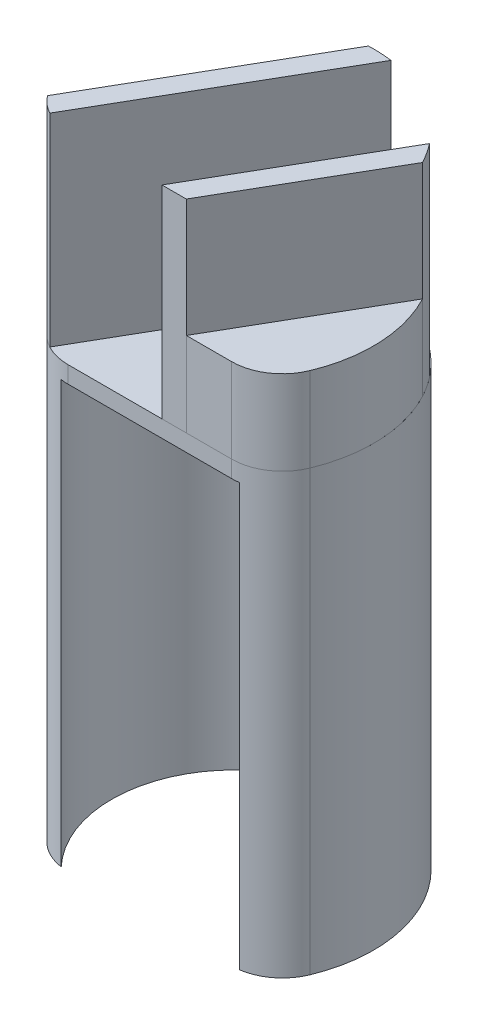
ISO-10303-21;
HEADER;
FILE_DESCRIPTION(('STEP AP214'),'2;1');
FILE_NAME('part.step','',(''),(''),'','','');
FILE_SCHEMA(('AUTOMOTIVE_DESIGN { 1 0 10303 214 1 1 1 1 }'));
ENDSEC;
DATA;
#1=APPLICATION_CONTEXT('core data for automotive mechanical design processes');
#2=APPLICATION_PROTOCOL_DEFINITION('international standard','automotive_design',2000,#1);
#3=PRODUCT_CONTEXT('',#1,'mechanical');
#4=PRODUCT('Part','Part','',(#3));
#5=PRODUCT_RELATED_PRODUCT_CATEGORY('part','',(#4));
#6=PRODUCT_DEFINITION_FORMATION('','',#4);
#7=PRODUCT_DEFINITION_CONTEXT('part definition',#1,'design');
#8=PRODUCT_DEFINITION('design','',#6,#7);
#9=PRODUCT_DEFINITION_SHAPE('','',#8);
#10=(LENGTH_UNIT() NAMED_UNIT(*) SI_UNIT(.MILLI.,.METRE.));
#11=(NAMED_UNIT(*) PLANE_ANGLE_UNIT() SI_UNIT($,.RADIAN.));
#12=(NAMED_UNIT(*) SI_UNIT($,.STERADIAN.) SOLID_ANGLE_UNIT());
#13=UNCERTAINTY_MEASURE_WITH_UNIT(LENGTH_MEASURE(1.E-05),#10,'distance_accuracy_value','');
#14=(GEOMETRIC_REPRESENTATION_CONTEXT(3) GLOBAL_UNCERTAINTY_ASSIGNED_CONTEXT((#13)) GLOBAL_UNIT_ASSIGNED_CONTEXT((#10,
#11,#12)) REPRESENTATION_CONTEXT('',''));
#15=CARTESIAN_POINT('',(0.,0.,0.));
#16=DIRECTION('',(0.,0.,1.));
#17=DIRECTION('',(1.,0.,0.));
#18=AXIS2_PLACEMENT_3D('',#15,#16,#17);
#19=CARTESIAN_POINT('',(0.,-3.,0.));
#20=DIRECTION('',(0.,1.,0.));
#21=DIRECTION('',(0.,0.,1.));
#22=AXIS2_PLACEMENT_3D('',#19,#20,#21);
#23=CYLINDRICAL_SURFACE('',#22,16.5);
#24=CARTESIAN_POINT('',(0.,37.,0.));
#25=DIRECTION('',(0.,-1.,0.));
#26=DIRECTION('',(0.,0.,1.));
#27=AXIS2_PLACEMENT_3D('',#24,#25,#26);
#28=CIRCLE('',#27,16.5);
#29=CARTESIAN_POINT('',(-16.0854825966207,37.,-3.67522103196701));
#30=VERTEX_POINT('',#29);
#31=CARTESIAN_POINT('',(-10.8657282210569,37.,-12.4171635338401));
#32=VERTEX_POINT('',#31);
#33=EDGE_CURVE('E114',#30,#32,#28,.T.);
#34=ORIENTED_EDGE('',*,*,#33,.F.);
#35=DIRECTION('',(0.,1.,0.));
#36=VECTOR('',#35,1.);
#37=CARTESIAN_POINT('',(-16.0854825966207,-3.,-3.67522103196701));
#38=LINE('',#37,#36);
#39=CARTESIAN_POINT('',(-16.0854825966207,-3.,-3.67522103196701));
#40=VERTEX_POINT('',#39);
#41=EDGE_CURVE('E12',#40,#30,#38,.T.);
#42=ORIENTED_EDGE('',*,*,#41,.F.);
#43=CARTESIAN_POINT('',(0.,-3.,0.));
#44=DIRECTION('',(0.,-1.,0.));
#45=DIRECTION('',(0.,0.,1.));
#46=AXIS2_PLACEMENT_3D('',#43,#44,#45);
#47=CIRCLE('',#46,16.5);
#48=CARTESIAN_POINT('',(-10.8657282210569,-3.,-12.4171635338401));
#49=VERTEX_POINT('',#48);
#50=EDGE_CURVE('E108',#40,#49,#47,.T.);
#51=ORIENTED_EDGE('',*,*,#50,.T.);
#52=DIRECTION('',(0.,1.,0.));
#53=VECTOR('',#52,1.);
#54=CARTESIAN_POINT('',(-10.8657282210569,-3.,-12.4171635338401));
#55=LINE('',#54,#53);
#56=EDGE_CURVE('E53',#49,#32,#55,.T.);
#57=ORIENTED_EDGE('',*,*,#56,.T.);
#58=EDGE_LOOP('',(#34,#42,#51,#57));
#59=FACE_BOUND('',#58,.T.);
#60=ADVANCED_FACE('F50',(#59),#23,.F.);
#61=CARTESIAN_POINT('',(-16.4325325809638,-3.,-3.80153689607047));
#62=DIRECTION('',(-0.342020143325677,0.,0.939692620785905));
#63=DIRECTION('',(0.939692620785906,0.,0.342020143325677));
#64=AXIS2_PLACEMENT_3D('',#61,#62,#63);
#65=PLANE('',#64);
#66=DIRECTION('',(0.939692620785905,0.,0.342020143325677));
#67=VECTOR('',#66,1.);
#68=CARTESIAN_POINT('',(-16.4325325809638,37.,-3.80153689607047));
#69=LINE('',#68,#67);
#70=CARTESIAN_POINT('',(-16.4325325809638,37.,-3.80153689607047));
#71=VERTEX_POINT('',#70);
#72=EDGE_CURVE('E110',#71,#30,#69,.T.);
#73=ORIENTED_EDGE('',*,*,#72,.F.);
#74=DIRECTION('',(0.,1.,0.));
#75=VECTOR('',#74,1.);
#76=CARTESIAN_POINT('',(-16.4325325809638,-3.,-3.80153689607047));
#77=LINE('',#76,#75);
#78=CARTESIAN_POINT('',(-16.4325325809638,-3.,-3.80153689607047));
#79=VERTEX_POINT('',#78);
#80=EDGE_CURVE('E59',#79,#71,#77,.T.);
#81=ORIENTED_EDGE('',*,*,#80,.F.);
#82=DIRECTION('',(0.939692620785905,0.,0.342020143325677));
#83=VECTOR('',#82,1.);
#84=CARTESIAN_POINT('',(-16.4325325809638,-3.,-3.80153689607047));
#85=LINE('',#84,#83);
#86=EDGE_CURVE('E105',#79,#40,#85,.T.);
#87=ORIENTED_EDGE('',*,*,#86,.T.);
#88=ORIENTED_EDGE('',*,*,#41,.T.);
#89=EDGE_LOOP('',(#73,#81,#87,#88));
#90=FACE_BOUND('',#89,.T.);
#91=ADVANCED_FACE('F124',(#90),#65,.T.);
#92=CARTESIAN_POINT('',(-16.4325325809638,-3.,-3.80153689607047));
#93=DIRECTION('',(-0.939692620785906,0.,-0.342020143325675));
#94=DIRECTION('',(-0.342020143325675,0.,0.939692620785906));
#95=AXIS2_PLACEMENT_3D('',#92,#93,#94);
#96=PLANE('',#95);
#97=DIRECTION('',(-0.342020143325675,0.,0.939692620785906));
#98=VECTOR('',#97,1.);
#99=CARTESIAN_POINT('',(-16.4325325809638,37.,-3.80153689607047));
#100=LINE('',#99,#98);
#101=CARTESIAN_POINT('',(-13.0123311477071,37.,-13.1984631039295));
#102=VERTEX_POINT('',#101);
#103=EDGE_CURVE('E100',#102,#71,#100,.T.);
#104=ORIENTED_EDGE('',*,*,#103,.F.);
#105=DIRECTION('',(0.,1.,0.));
#106=VECTOR('',#105,1.);
#107=CARTESIAN_POINT('',(-13.0123311477071,-3.,-13.1984631039295));
#108=LINE('',#107,#106);
#109=CARTESIAN_POINT('',(-13.0123311477071,-3.,-13.1984631039295));
#110=VERTEX_POINT('',#109);
#111=EDGE_CURVE('E95',#110,#102,#108,.T.);
#112=ORIENTED_EDGE('',*,*,#111,.F.);
#113=DIRECTION('',(-0.342020143325675,0.,0.939692620785906));
#114=VECTOR('',#113,1.);
#115=CARTESIAN_POINT('',(-16.4325325809638,-3.,-3.80153689607047));
#116=LINE('',#115,#114);
#117=EDGE_CURVE('E98',#110,#79,#116,.T.);
#118=ORIENTED_EDGE('',*,*,#117,.T.);
#119=ORIENTED_EDGE('',*,*,#80,.T.);
#120=EDGE_LOOP('',(#104,#112,#118,#119));
#121=FACE_BOUND('',#120,.T.);
#122=ADVANCED_FACE('F97',(#121),#96,.T.);
#123=CARTESIAN_POINT('',(-13.0123311477071,-3.,-13.1984631039295));
#124=DIRECTION('',(0.342020143325676,0.,-0.939692620785906));
#125=DIRECTION('',(-0.939692620785906,0.,-0.342020143325676));
#126=AXIS2_PLACEMENT_3D('',#123,#124,#125);
#127=PLANE('',#126);
#128=DIRECTION('',(-0.939692620785906,0.,-0.342020143325676));
#129=VECTOR('',#128,1.);
#130=CARTESIAN_POINT('',(-13.0123311477071,37.,-13.1984631039295));
#131=LINE('',#130,#129);
#132=EDGE_CURVE('E117',#32,#102,#131,.T.);
#133=ORIENTED_EDGE('',*,*,#132,.F.);
#134=ORIENTED_EDGE('',*,*,#56,.F.);
#135=DIRECTION('',(-0.939692620785906,0.,-0.342020143325676));
#136=VECTOR('',#135,1.);
#137=CARTESIAN_POINT('',(-13.0123311477071,-3.,-13.1984631039295));
#138=LINE('',#137,#136);
#139=EDGE_CURVE('E104',#49,#110,#138,.T.);
#140=ORIENTED_EDGE('',*,*,#139,.T.);
#141=ORIENTED_EDGE('',*,*,#111,.T.);
#142=EDGE_LOOP('',(#133,#134,#140,#141));
#143=FACE_BOUND('',#142,.T.);
#144=ADVANCED_FACE('F107',(#143),#127,.T.);
#145=CARTESIAN_POINT('',(0.,-3.,0.));
#146=DIRECTION('',(0.,1.,0.));
#147=DIRECTION('',(0.,0.,1.));
#148=AXIS2_PLACEMENT_3D('',#145,#146,#147);
#149=PLANE('',#148);
#150=ORIENTED_EDGE('',*,*,#50,.F.);
#151=ORIENTED_EDGE('',*,*,#86,.F.);
#152=ORIENTED_EDGE('',*,*,#117,.F.);
#153=ORIENTED_EDGE('',*,*,#139,.F.);
#154=EDGE_LOOP('',(#150,#151,#152,#153));
#155=FACE_BOUND('',#154,.T.);
#156=ADVANCED_FACE('F103',(#155),#149,.F.);
#157=CARTESIAN_POINT('',(0.,37.,0.));
#158=DIRECTION('',(0.,1.,0.));
#159=DIRECTION('',(0.,0.,1.));
#160=AXIS2_PLACEMENT_3D('',#157,#158,#159);
#161=PLANE('',#160);
#162=ORIENTED_EDGE('',*,*,#33,.T.);
#163=ORIENTED_EDGE('',*,*,#132,.T.);
#164=ORIENTED_EDGE('',*,*,#103,.T.);
#165=ORIENTED_EDGE('',*,*,#72,.T.);
#166=EDGE_LOOP('',(#162,#163,#164,#165));
#167=FACE_BOUND('',#166,.T.);
#168=ADVANCED_FACE('F123',(#167),#161,.T.);
#169=CLOSED_SHELL('',(#60,#91,#122,#144,#156,#168));
#170=MANIFOLD_SOLID_BREP('B2',#169);
#171=CARTESIAN_POINT('',(4.33012701892216,47.,10.));
#172=DIRECTION('',(0.866025403784436,0.,0.500000000000004));
#173=DIRECTION('',(0.500000000000004,0.,-0.866025403784436));
#174=AXIS2_PLACEMENT_3D('',#171,#172,#173);
#175=PLANE('',#174);
#176=DIRECTION('',(-0.500000000000004,0.,0.866025403784436));
#177=VECTOR('',#176,1.);
#178=CARTESIAN_POINT('',(4.33012701892216,37.,10.));
#179=LINE('',#178,#177);
#180=CARTESIAN_POINT('',(14.5721396998828,37.,-7.73968633518831));
#181=VERTEX_POINT('',#180);
#182=CARTESIAN_POINT('',(4.33012701892216,37.,10.));
#183=VERTEX_POINT('',#182);
#184=EDGE_CURVE('E247',#181,#183,#179,.T.);
#185=ORIENTED_EDGE('',*,*,#184,.T.);
#186=DIRECTION('',(0.,-1.,0.));
#187=VECTOR('',#186,1.);
#188=CARTESIAN_POINT('',(4.33012701892216,47.,10.));
#189=LINE('',#188,#187);
#190=CARTESIAN_POINT('',(4.33012701892216,47.,10.));
#191=VERTEX_POINT('',#190);
#192=EDGE_CURVE('E48',#191,#183,#189,.T.);
#193=ORIENTED_EDGE('',*,*,#192,.F.);
#194=DIRECTION('',(-0.500000000000004,0.,0.866025403784436));
#195=VECTOR('',#194,1.);
#196=CARTESIAN_POINT('',(4.33012701892216,47.,10.));
#197=LINE('',#196,#195);
#198=CARTESIAN_POINT('',(14.5721396998828,47.,-7.73968633518831));
#199=VERTEX_POINT('',#198);
#200=EDGE_CURVE('E235',#199,#191,#197,.T.);
#201=ORIENTED_EDGE('',*,*,#200,.F.);
#202=DIRECTION('',(0.,-1.,0.));
#203=VECTOR('',#202,1.);
#204=CARTESIAN_POINT('',(14.5721396998828,47.,-7.73968633518831));
#205=LINE('',#204,#203);
#206=EDGE_CURVE('E243',#199,#181,#205,.T.);
#207=ORIENTED_EDGE('',*,*,#206,.T.);
#208=EDGE_LOOP('',(#185,#193,#201,#207));
#209=FACE_BOUND('',#208,.T.);
#210=ADVANCED_FACE('F184',(#209),#175,.F.);
#211=CARTESIAN_POINT('',(4.33012701892216,47.,10.));
#212=DIRECTION('',(0.,0.,-1.));
#213=DIRECTION('',(-1.,0.,0.));
#214=AXIS2_PLACEMENT_3D('',#211,#212,#213);
#215=PLANE('',#214);
#216=DIRECTION('',(1.,0.,0.));
#217=VECTOR('',#216,1.);
#218=CARTESIAN_POINT('',(4.33012701892216,37.,10.));
#219=LINE('',#218,#217);
#220=CARTESIAN_POINT('',(9.7082439194738,37.,10.));
#221=VERTEX_POINT('',#220);
#222=EDGE_CURVE('E239',#183,#221,#219,.T.);
#223=ORIENTED_EDGE('',*,*,#222,.T.);
#224=DIRECTION('',(0.,-1.,0.));
#225=VECTOR('',#224,1.);
#226=CARTESIAN_POINT('',(9.7082439194738,47.,10.));
#227=LINE('',#226,#225);
#228=CARTESIAN_POINT('',(9.7082439194738,47.,10.));
#229=VERTEX_POINT('',#228);
#230=EDGE_CURVE('E192',#229,#221,#227,.T.);
#231=ORIENTED_EDGE('',*,*,#230,.F.);
#232=DIRECTION('',(1.,0.,0.));
#233=VECTOR('',#232,1.);
#234=CARTESIAN_POINT('',(4.33012701892216,47.,10.));
#235=LINE('',#234,#233);
#236=EDGE_CURVE('E230',#191,#229,#235,.T.);
#237=ORIENTED_EDGE('',*,*,#236,.F.);
#238=ORIENTED_EDGE('',*,*,#192,.T.);
#239=EDGE_LOOP('',(#223,#231,#237,#238));
#240=FACE_BOUND('',#239,.T.);
#241=ADVANCED_FACE('F238',(#240),#215,.F.);
#242=CARTESIAN_POINT('',(9.7082439194738,47.,4.));
#243=DIRECTION('',(0.,-1.,0.));
#244=DIRECTION('',(0.,0.,-1.));
#245=AXIS2_PLACEMENT_3D('',#242,#243,#244);
#246=CYLINDRICAL_SURFACE('',#245,6.);
#247=CARTESIAN_POINT('',(9.7082439194738,37.,4.));
#248=DIRECTION('',(0.,1.,0.));
#249=DIRECTION('',(0.,0.,1.));
#250=AXIS2_PLACEMENT_3D('',#247,#248,#249);
#251=CIRCLE('',#250,6.);
#252=CARTESIAN_POINT('',(15.2558118734588,37.,6.28571428571429));
#253=VERTEX_POINT('',#252);
#254=EDGE_CURVE('E217',#221,#253,#251,.T.);
#255=ORIENTED_EDGE('',*,*,#254,.T.);
#256=DIRECTION('',(0.,-1.,0.));
#257=VECTOR('',#256,1.);
#258=CARTESIAN_POINT('',(15.2558118734588,47.,6.28571428571429));
#259=LINE('',#258,#257);
#260=CARTESIAN_POINT('',(15.2558118734588,47.,6.28571428571429));
#261=VERTEX_POINT('',#260);
#262=EDGE_CURVE('E240',#261,#253,#259,.T.);
#263=ORIENTED_EDGE('',*,*,#262,.F.);
#264=CARTESIAN_POINT('',(9.7082439194738,47.,4.));
#265=DIRECTION('',(0.,1.,0.));
#266=DIRECTION('',(0.,0.,1.));
#267=AXIS2_PLACEMENT_3D('',#264,#265,#266);
#268=CIRCLE('',#267,6.);
#269=EDGE_CURVE('E233',#229,#261,#268,.T.);
#270=ORIENTED_EDGE('',*,*,#269,.F.);
#271=ORIENTED_EDGE('',*,*,#230,.T.);
#272=EDGE_LOOP('',(#255,#263,#270,#271));
#273=FACE_BOUND('',#272,.T.);
#274=ADVANCED_FACE('F241',(#273),#246,.T.);
#275=CARTESIAN_POINT('',(0.,47.,0.));
#276=DIRECTION('',(0.,-1.,0.));
#277=DIRECTION('',(0.,0.,-1.));
#278=AXIS2_PLACEMENT_3D('',#275,#276,#277);
#279=CYLINDRICAL_SURFACE('',#278,16.5);
#280=CARTESIAN_POINT('',(0.,37.,0.));
#281=DIRECTION('',(0.,1.,0.));
#282=DIRECTION('',(0.,0.,1.));
#283=AXIS2_PLACEMENT_3D('',#280,#281,#282);
#284=CIRCLE('',#283,16.5);
#285=EDGE_CURVE('E223',#253,#181,#284,.T.);
#286=ORIENTED_EDGE('',*,*,#285,.T.);
#287=ORIENTED_EDGE('',*,*,#206,.F.);
#288=CARTESIAN_POINT('',(0.,47.,0.));
#289=DIRECTION('',(0.,1.,0.));
#290=DIRECTION('',(0.,0.,1.));
#291=AXIS2_PLACEMENT_3D('',#288,#289,#290);
#292=CIRCLE('',#291,16.5);
#293=EDGE_CURVE('E200',#261,#199,#292,.T.);
#294=ORIENTED_EDGE('',*,*,#293,.F.);
#295=ORIENTED_EDGE('',*,*,#262,.T.);
#296=EDGE_LOOP('',(#286,#287,#294,#295));
#297=FACE_BOUND('',#296,.T.);
#298=ADVANCED_FACE('F254',(#297),#279,.T.);
#299=CARTESIAN_POINT('',(0.,47.,0.));
#300=DIRECTION('',(0.,1.,0.));
#301=DIRECTION('',(0.,0.,1.));
#302=AXIS2_PLACEMENT_3D('',#299,#300,#301);
#303=PLANE('',#302);
#304=ORIENTED_EDGE('',*,*,#200,.T.);
#305=ORIENTED_EDGE('',*,*,#236,.T.);
#306=ORIENTED_EDGE('',*,*,#269,.T.);
#307=ORIENTED_EDGE('',*,*,#293,.T.);
#308=EDGE_LOOP('',(#304,#305,#306,#307));
#309=FACE_BOUND('',#308,.T.);
#310=ADVANCED_FACE('F231',(#309),#303,.T.);
#311=CARTESIAN_POINT('',(0.,37.,0.));
#312=DIRECTION('',(0.,1.,0.));
#313=DIRECTION('',(0.,0.,1.));
#314=AXIS2_PLACEMENT_3D('',#311,#312,#313);
#315=PLANE('',#314);
#316=ORIENTED_EDGE('',*,*,#184,.F.);
#317=ORIENTED_EDGE('',*,*,#285,.F.);
#318=ORIENTED_EDGE('',*,*,#254,.F.);
#319=ORIENTED_EDGE('',*,*,#222,.F.);
#320=EDGE_LOOP('',(#316,#317,#318,#319));
#321=FACE_BOUND('',#320,.T.);
#322=ADVANCED_FACE('F257',(#321),#315,.F.);
#323=CLOSED_SHELL('',(#210,#241,#274,#298,#310,#322));
#324=MANIFOLD_SOLID_BREP('B6',#323);
#325=CARTESIAN_POINT('',(0.,61.,0.));
#326=DIRECTION('',(0.,-1.,0.));
#327=DIRECTION('',(0.,0.,-1.));
#328=AXIS2_PLACEMENT_3D('',#325,#326,#327);
#329=CYLINDRICAL_SURFACE('',#328,16.5);
#330=CARTESIAN_POINT('',(0.,37.,0.));
#331=DIRECTION('',(0.,1.,0.));
#332=DIRECTION('',(0.,0.,1.));
#333=AXIS2_PLACEMENT_3D('',#330,#331,#332);
#334=CIRCLE('',#333,16.5);
#335=CARTESIAN_POINT('',(2.22258025338506,37.,-16.3496219227621));
#336=VERTEX_POINT('',#335);
#337=CARTESIAN_POINT('',(-0.583304866344873,37.,-16.4896863351884));
#338=VERTEX_POINT('',#337);
#339=EDGE_CURVE('E381',#336,#338,#334,.T.);
#340=ORIENTED_EDGE('',*,*,#339,.T.);
#341=DIRECTION('',(0.,-1.,0.));
#342=VECTOR('',#341,1.);
#343=CARTESIAN_POINT('',(-0.583304866344873,61.,-16.4896863351884));
#344=LINE('',#343,#342);
#345=CARTESIAN_POINT('',(-0.583304866344873,61.,-16.4896863351884));
#346=VERTEX_POINT('',#345);
#347=EDGE_CURVE('E182',#346,#338,#344,.T.);
#348=ORIENTED_EDGE('',*,*,#347,.F.);
#349=CARTESIAN_POINT('',(0.,61.,0.));
#350=DIRECTION('',(0.,1.,0.));
#351=DIRECTION('',(0.,0.,1.));
#352=AXIS2_PLACEMENT_3D('',#349,#350,#351);
#353=CIRCLE('',#352,16.5);
#354=CARTESIAN_POINT('',(2.22258025338506,61.,-16.3496219227621));
#355=VERTEX_POINT('',#354);
#356=EDGE_CURVE('E369',#355,#346,#353,.T.);
#357=ORIENTED_EDGE('',*,*,#356,.F.);
#358=DIRECTION('',(0.,-1.,0.));
#359=VECTOR('',#358,1.);
#360=CARTESIAN_POINT('',(2.22258025338506,61.,-16.3496219227621));
#361=LINE('',#360,#359);
#362=EDGE_CURVE('E377',#355,#336,#361,.T.);
#363=ORIENTED_EDGE('',*,*,#362,.T.);
#364=EDGE_LOOP('',(#340,#348,#357,#363));
#365=FACE_BOUND('',#364,.T.);
#366=ADVANCED_FACE('F318',(#365),#329,.T.);
#367=CARTESIAN_POINT('',(-0.583304866344873,61.,-16.4896863351884));
#368=DIRECTION('',(0.866025403784436,0.,0.500000000000004));
#369=DIRECTION('',(0.500000000000004,0.,-0.866025403784436));
#370=AXIS2_PLACEMENT_3D('',#367,#368,#369);
#371=PLANE('',#370);
#372=DIRECTION('',(-0.500000000000004,0.,0.866025403784436));
#373=VECTOR('',#372,1.);
#374=CARTESIAN_POINT('',(-0.583304866344873,37.,-16.4896863351884));
#375=LINE('',#374,#373);
#376=CARTESIAN_POINT('',(-14.4987670892268,37.,7.61260124564826));
#377=VERTEX_POINT('',#376);
#378=EDGE_CURVE('E373',#338,#377,#375,.T.);
#379=ORIENTED_EDGE('',*,*,#378,.T.);
#380=DIRECTION('',(0.,-1.,0.));
#381=VECTOR('',#380,1.);
#382=CARTESIAN_POINT('',(-14.4987670892268,61.,7.61260124564826));
#383=LINE('',#382,#381);
#384=CARTESIAN_POINT('',(-14.4987670892268,61.,7.61260124564826));
#385=VERTEX_POINT('',#384);
#386=EDGE_CURVE('E326',#385,#377,#383,.T.);
#387=ORIENTED_EDGE('',*,*,#386,.F.);
#388=DIRECTION('',(-0.500000000000004,0.,0.866025403784436));
#389=VECTOR('',#388,1.);
#390=CARTESIAN_POINT('',(-0.583304866344873,61.,-16.4896863351884));
#391=LINE('',#390,#389);
#392=EDGE_CURVE('E364',#346,#385,#391,.T.);
#393=ORIENTED_EDGE('',*,*,#392,.F.);
#394=ORIENTED_EDGE('',*,*,#347,.T.);
#395=EDGE_LOOP('',(#379,#387,#393,#394));
#396=FACE_BOUND('',#395,.T.);
#397=ADVANCED_FACE('F372',(#396),#371,.F.);
#398=CARTESIAN_POINT('',(-9.7082439194738,61.,4.));
#399=DIRECTION('',(0.,-1.,0.));
#400=DIRECTION('',(0.,0.,-1.));
#401=AXIS2_PLACEMENT_3D('',#398,#399,#400);
#402=CYLINDRICAL_SURFACE('',#401,6.);
#403=CARTESIAN_POINT('',(-9.7082439194738,37.,4.));
#404=DIRECTION('',(0.,1.,0.));
#405=DIRECTION('',(0.,0.,1.));
#406=AXIS2_PLACEMENT_3D('',#403,#404,#405);
#407=CIRCLE('',#406,6.);
#408=CARTESIAN_POINT('',(-12.5707356616124,37.,9.27315285443048));
#409=VERTEX_POINT('',#408);
#410=EDGE_CURVE('E351',#377,#409,#407,.T.);
#411=ORIENTED_EDGE('',*,*,#410,.T.);
#412=DIRECTION('',(0.,-1.,0.));
#413=VECTOR('',#412,1.);
#414=CARTESIAN_POINT('',(-12.5707356616124,61.,9.27315285443048));
#415=LINE('',#414,#413);
#416=CARTESIAN_POINT('',(-12.5707356616124,61.,9.27315285443048));
#417=VERTEX_POINT('',#416);
#418=EDGE_CURVE('E374',#417,#409,#415,.T.);
#419=ORIENTED_EDGE('',*,*,#418,.F.);
#420=CARTESIAN_POINT('',(-9.7082439194738,61.,4.));
#421=DIRECTION('',(0.,1.,0.));
#422=DIRECTION('',(0.,0.,1.));
#423=AXIS2_PLACEMENT_3D('',#420,#421,#422);
#424=CIRCLE('',#423,6.);
#425=EDGE_CURVE('E367',#385,#417,#424,.T.);
#426=ORIENTED_EDGE('',*,*,#425,.F.);
#427=ORIENTED_EDGE('',*,*,#386,.T.);
#428=EDGE_LOOP('',(#411,#419,#426,#427));
#429=FACE_BOUND('',#428,.T.);
#430=ADVANCED_FACE('F375',(#429),#402,.T.);
#431=CARTESIAN_POINT('',(2.22258025338506,61.,-16.3496219227621));
#432=DIRECTION('',(-0.866025403784436,0.,-0.500000000000004));
#433=DIRECTION('',(-0.500000000000004,0.,0.866025403784436));
#434=AXIS2_PLACEMENT_3D('',#431,#432,#433);
#435=PLANE('',#434);
#436=DIRECTION('',(0.500000000000004,0.,-0.866025403784436));
#437=VECTOR('',#436,1.);
#438=CARTESIAN_POINT('',(2.22258025338506,37.,-16.3496219227621));
#439=LINE('',#438,#437);
#440=EDGE_CURVE('E357',#409,#336,#439,.T.);
#441=ORIENTED_EDGE('',*,*,#440,.T.);
#442=ORIENTED_EDGE('',*,*,#362,.F.);
#443=DIRECTION('',(0.500000000000004,0.,-0.866025403784436));
#444=VECTOR('',#443,1.);
#445=CARTESIAN_POINT('',(2.22258025338506,61.,-16.3496219227621));
#446=LINE('',#445,#444);
#447=EDGE_CURVE('E334',#417,#355,#446,.T.);
#448=ORIENTED_EDGE('',*,*,#447,.F.);
#449=ORIENTED_EDGE('',*,*,#418,.T.);
#450=EDGE_LOOP('',(#441,#442,#448,#449));
#451=FACE_BOUND('',#450,.T.);
#452=ADVANCED_FACE('F388',(#451),#435,.F.);
#453=CARTESIAN_POINT('',(0.,61.,0.));
#454=DIRECTION('',(0.,1.,0.));
#455=DIRECTION('',(0.,0.,1.));
#456=AXIS2_PLACEMENT_3D('',#453,#454,#455);
#457=PLANE('',#456);
#458=ORIENTED_EDGE('',*,*,#356,.T.);
#459=ORIENTED_EDGE('',*,*,#392,.T.);
#460=ORIENTED_EDGE('',*,*,#425,.T.);
#461=ORIENTED_EDGE('',*,*,#447,.T.);
#462=EDGE_LOOP('',(#458,#459,#460,#461));
#463=FACE_BOUND('',#462,.T.);
#464=ADVANCED_FACE('F365',(#463),#457,.T.);
#465=CARTESIAN_POINT('',(0.,37.,0.));
#466=DIRECTION('',(0.,1.,0.));
#467=DIRECTION('',(0.,0.,1.));
#468=AXIS2_PLACEMENT_3D('',#465,#466,#467);
#469=PLANE('',#468);
#470=ORIENTED_EDGE('',*,*,#339,.F.);
#471=ORIENTED_EDGE('',*,*,#440,.F.);
#472=ORIENTED_EDGE('',*,*,#410,.F.);
#473=ORIENTED_EDGE('',*,*,#378,.F.);
#474=EDGE_LOOP('',(#470,#471,#472,#473));
#475=FACE_BOUND('',#474,.T.);
#476=ADVANCED_FACE('F391',(#475),#469,.F.);
#477=CLOSED_SHELL('',(#366,#397,#430,#452,#464,#476));
#478=MANIFOLD_SOLID_BREP('B42',#477);
#479=CARTESIAN_POINT('',(0.,61.,0.));
#480=DIRECTION('',(0.,-1.,0.));
#481=DIRECTION('',(0.,0.,-1.));
#482=AXIS2_PLACEMENT_3D('',#479,#480,#481);
#483=CYLINDRICAL_SURFACE('',#482,16.5);
#484=CARTESIAN_POINT('',(0.,37.,0.));
#485=DIRECTION('',(0.,1.,0.));
#486=DIRECTION('',(0.,0.,1.));
#487=AXIS2_PLACEMENT_3D('',#484,#485,#486);
#488=CIRCLE('',#487,16.5);
#489=CARTESIAN_POINT('',(14.5721396998828,37.,-7.73968633518831));
#490=VERTEX_POINT('',#489);
#491=CARTESIAN_POINT('',(13.0478978006905,37.,-10.099621922762));
#492=VERTEX_POINT('',#491);
#493=EDGE_CURVE('E514',#490,#492,#488,.T.);
#494=ORIENTED_EDGE('',*,*,#493,.T.);
#495=DIRECTION('',(0.,-1.,0.));
#496=VECTOR('',#495,1.);
#497=CARTESIAN_POINT('',(13.0478978006905,61.,-10.099621922762));
#498=LINE('',#497,#496);
#499=CARTESIAN_POINT('',(13.0478978006905,61.,-10.099621922762));
#500=VERTEX_POINT('',#499);
#501=EDGE_CURVE('E316',#500,#492,#498,.T.);
#502=ORIENTED_EDGE('',*,*,#501,.F.);
#503=CARTESIAN_POINT('',(0.,61.,0.));
#504=DIRECTION('',(0.,1.,0.));
#505=DIRECTION('',(0.,0.,1.));
#506=AXIS2_PLACEMENT_3D('',#503,#504,#505);
#507=CIRCLE('',#506,16.5);
#508=CARTESIAN_POINT('',(14.5721396998828,61.,-7.73968633518831));
#509=VERTEX_POINT('',#508);
#510=EDGE_CURVE('E502',#509,#500,#507,.T.);
#511=ORIENTED_EDGE('',*,*,#510,.F.);
#512=DIRECTION('',(0.,-1.,0.));
#513=VECTOR('',#512,1.);
#514=CARTESIAN_POINT('',(14.5721396998828,61.,-7.73968633518831));
#515=LINE('',#514,#513);
#516=EDGE_CURVE('E510',#509,#490,#515,.T.);
#517=ORIENTED_EDGE('',*,*,#516,.T.);
#518=EDGE_LOOP('',(#494,#502,#511,#517));
#519=FACE_BOUND('',#518,.T.);
#520=ADVANCED_FACE('F451',(#519),#483,.T.);
#521=CARTESIAN_POINT('',(13.0478978006905,61.,-10.099621922762));
#522=DIRECTION('',(0.866025403784436,0.,0.500000000000004));
#523=DIRECTION('',(0.500000000000004,0.,-0.866025403784436));
#524=AXIS2_PLACEMENT_3D('',#521,#522,#523);
#525=PLANE('',#524);
#526=DIRECTION('',(-0.500000000000004,0.,0.866025403784436));
#527=VECTOR('',#526,1.);
#528=CARTESIAN_POINT('',(13.0478978006905,37.,-10.099621922762));
#529=LINE('',#528,#527);
#530=CARTESIAN_POINT('',(1.44337567297402,37.,10.));
#531=VERTEX_POINT('',#530);
#532=EDGE_CURVE('E506',#492,#531,#529,.T.);
#533=ORIENTED_EDGE('',*,*,#532,.T.);
#534=DIRECTION('',(0.,-1.,0.));
#535=VECTOR('',#534,1.);
#536=CARTESIAN_POINT('',(1.44337567297402,61.,10.));
#537=LINE('',#536,#535);
#538=CARTESIAN_POINT('',(1.44337567297402,61.,10.));
#539=VERTEX_POINT('',#538);
#540=EDGE_CURVE('E459',#539,#531,#537,.T.);
#541=ORIENTED_EDGE('',*,*,#540,.F.);
#542=DIRECTION('',(-0.500000000000004,0.,0.866025403784436));
#543=VECTOR('',#542,1.);
#544=CARTESIAN_POINT('',(13.0478978006905,61.,-10.099621922762));
#545=LINE('',#544,#543);
#546=EDGE_CURVE('E497',#500,#539,#545,.T.);
#547=ORIENTED_EDGE('',*,*,#546,.F.);
#548=ORIENTED_EDGE('',*,*,#501,.T.);
#549=EDGE_LOOP('',(#533,#541,#547,#548));
#550=FACE_BOUND('',#549,.T.);
#551=ADVANCED_FACE('F505',(#550),#525,.F.);
#552=CARTESIAN_POINT('',(1.44337567297402,61.,10.));
#553=DIRECTION('',(0.,0.,-1.));
#554=DIRECTION('',(-1.,0.,0.));
#555=AXIS2_PLACEMENT_3D('',#552,#553,#554);
#556=PLANE('',#555);
#557=DIRECTION('',(1.,0.,0.));
#558=VECTOR('',#557,1.);
#559=CARTESIAN_POINT('',(1.44337567297402,37.,10.));
#560=LINE('',#559,#558);
#561=CARTESIAN_POINT('',(4.33012701892216,37.,10.));
#562=VERTEX_POINT('',#561);
#563=EDGE_CURVE('E484',#531,#562,#560,.T.);
#564=ORIENTED_EDGE('',*,*,#563,.T.);
#565=DIRECTION('',(0.,-1.,0.));
#566=VECTOR('',#565,1.);
#567=CARTESIAN_POINT('',(4.33012701892216,61.,10.));
#568=LINE('',#567,#566);
#569=CARTESIAN_POINT('',(4.33012701892216,61.,10.));
#570=VERTEX_POINT('',#569);
#571=EDGE_CURVE('E507',#570,#562,#568,.T.);
#572=ORIENTED_EDGE('',*,*,#571,.F.);
#573=DIRECTION('',(1.,0.,0.));
#574=VECTOR('',#573,1.);
#575=CARTESIAN_POINT('',(1.44337567297402,61.,10.));
#576=LINE('',#575,#574);
#577=EDGE_CURVE('E500',#539,#570,#576,.T.);
#578=ORIENTED_EDGE('',*,*,#577,.F.);
#579=ORIENTED_EDGE('',*,*,#540,.T.);
#580=EDGE_LOOP('',(#564,#572,#578,#579));
#581=FACE_BOUND('',#580,.T.);
#582=ADVANCED_FACE('F508',(#581),#556,.F.);
#583=CARTESIAN_POINT('',(14.5721396998828,61.,-7.73968633518831));
#584=DIRECTION('',(-0.866025403784436,0.,-0.500000000000004));
#585=DIRECTION('',(-0.500000000000004,0.,0.866025403784436));
#586=AXIS2_PLACEMENT_3D('',#583,#584,#585);
#587=PLANE('',#586);
#588=DIRECTION('',(0.500000000000004,0.,-0.866025403784436));
#589=VECTOR('',#588,1.);
#590=CARTESIAN_POINT('',(14.5721396998828,37.,-7.73968633518831));
#591=LINE('',#590,#589);
#592=EDGE_CURVE('E490',#562,#490,#591,.T.);
#593=ORIENTED_EDGE('',*,*,#592,.T.);
#594=ORIENTED_EDGE('',*,*,#516,.F.);
#595=DIRECTION('',(0.500000000000004,0.,-0.866025403784436));
#596=VECTOR('',#595,1.);
#597=CARTESIAN_POINT('',(14.5721396998828,61.,-7.73968633518831));
#598=LINE('',#597,#596);
#599=EDGE_CURVE('E467',#570,#509,#598,.T.);
#600=ORIENTED_EDGE('',*,*,#599,.F.);
#601=ORIENTED_EDGE('',*,*,#571,.T.);
#602=EDGE_LOOP('',(#593,#594,#600,#601));
#603=FACE_BOUND('',#602,.T.);
#604=ADVANCED_FACE('F521',(#603),#587,.F.);
#605=CARTESIAN_POINT('',(0.,61.,0.));
#606=DIRECTION('',(0.,1.,0.));
#607=DIRECTION('',(0.,0.,1.));
#608=AXIS2_PLACEMENT_3D('',#605,#606,#607);
#609=PLANE('',#608);
#610=ORIENTED_EDGE('',*,*,#510,.T.);
#611=ORIENTED_EDGE('',*,*,#546,.T.);
#612=ORIENTED_EDGE('',*,*,#577,.T.);
#613=ORIENTED_EDGE('',*,*,#599,.T.);
#614=EDGE_LOOP('',(#610,#611,#612,#613));
#615=FACE_BOUND('',#614,.T.);
#616=ADVANCED_FACE('F498',(#615),#609,.T.);
#617=CARTESIAN_POINT('',(0.,37.,0.));
#618=DIRECTION('',(0.,1.,0.));
#619=DIRECTION('',(0.,0.,1.));
#620=AXIS2_PLACEMENT_3D('',#617,#618,#619);
#621=PLANE('',#620);
#622=ORIENTED_EDGE('',*,*,#493,.F.);
#623=ORIENTED_EDGE('',*,*,#592,.F.);
#624=ORIENTED_EDGE('',*,*,#563,.F.);
#625=ORIENTED_EDGE('',*,*,#532,.F.);
#626=EDGE_LOOP('',(#622,#623,#624,#625));
#627=FACE_BOUND('',#626,.T.);
#628=ADVANCED_FACE('F524',(#627),#621,.F.);
#629=CLOSED_SHELL('',(#520,#551,#582,#604,#616,#628));
#630=MANIFOLD_SOLID_BREP('B176',#629);
#631=CARTESIAN_POINT('',(0.,35.,0.));
#632=DIRECTION('',(0.,-1.,0.));
#633=DIRECTION('',(0.,0.,-1.));
#634=AXIS2_PLACEMENT_3D('',#631,#632,#633);
#635=CYLINDRICAL_SURFACE('',#634,16.5);
#636=DIRECTION('',(0.,-1.,0.));
#637=VECTOR('',#636,1.);
#638=CARTESIAN_POINT('',(15.2558118734588,35.,6.28571428571429));
#639=LINE('',#638,#637);
#640=CARTESIAN_POINT('',(15.2558118734588,37.,6.28571428571428));
#641=VERTEX_POINT('',#640);
#642=CARTESIAN_POINT('',(15.2558118734588,-15.,6.2857142857143));
#643=VERTEX_POINT('',#642);
#644=EDGE_CURVE('E633',#641,#643,#639,.T.);
#645=ORIENTED_EDGE('',*,*,#644,.T.);
#646=CARTESIAN_POINT('',(0.,-15.,0.));
#647=DIRECTION('',(0.,-1.,0.));
#648=DIRECTION('',(0.,0.,-1.));
#649=AXIS2_PLACEMENT_3D('',#646,#647,#648);
#650=CIRCLE('',#649,16.5);
#651=CARTESIAN_POINT('',(-15.2558118734588,-15.,6.28571428571429));
#652=VERTEX_POINT('',#651);
#653=EDGE_CURVE('E636',#652,#643,#650,.T.);
#654=ORIENTED_EDGE('',*,*,#653,.F.);
#655=DIRECTION('',(0.,-1.,0.));
#656=VECTOR('',#655,1.);
#657=CARTESIAN_POINT('',(-15.2558118734588,35.,6.28571428571429));
#658=LINE('',#657,#656);
#659=CARTESIAN_POINT('',(-15.2558118734588,37.,6.28571428571428));
#660=VERTEX_POINT('',#659);
#661=EDGE_CURVE('E591',#652,#660,#658,.F.);
#662=ORIENTED_EDGE('',*,*,#661,.T.);
#663=CARTESIAN_POINT('',(0.,37.,0.));
#664=DIRECTION('',(0.,1.,0.));
#665=DIRECTION('',(0.,0.,1.));
#666=AXIS2_PLACEMENT_3D('',#663,#664,#665);
#667=CIRCLE('',#666,16.5);
#668=EDGE_CURVE('E667',#641,#660,#667,.T.);
#669=ORIENTED_EDGE('',*,*,#668,.F.);
#670=EDGE_LOOP('',(#645,#654,#662,#669));
#671=FACE_BOUND('',#670,.T.);
#672=ADVANCED_FACE('F575',(#671),#635,.T.);
#673=CARTESIAN_POINT('',(0.,35.,0.));
#674=DIRECTION('',(0.,-1.,0.));
#675=DIRECTION('',(0.,0.,-1.));
#676=AXIS2_PLACEMENT_3D('',#673,#674,#675);
#677=CYLINDRICAL_SURFACE('',#676,14.5);
#678=CARTESIAN_POINT('',(0.,35.,0.));
#679=DIRECTION('',(0.,1.,0.));
#680=DIRECTION('',(0.,0.,1.));
#681=AXIS2_PLACEMENT_3D('',#678,#679,#680);
#682=CIRCLE('',#681,14.5);
#683=CARTESIAN_POINT('',(10.5571544737025,35.,9.93964231843291));
#684=VERTEX_POINT('',#683);
#685=CARTESIAN_POINT('',(-10.5571544737025,35.,9.93964231843291));
#686=VERTEX_POINT('',#685);
#687=EDGE_CURVE('E670',#684,#686,#682,.T.);
#688=ORIENTED_EDGE('',*,*,#687,.T.);
#689=DIRECTION('',(0.,-1.,0.));
#690=VECTOR('',#689,1.);
#691=CARTESIAN_POINT('',(-10.5571544737025,35.,9.93964231843291));
#692=LINE('',#691,#690);
#693=CARTESIAN_POINT('',(-10.5571544737025,-15.,9.93964231843291));
#694=VERTEX_POINT('',#693);
#695=EDGE_CURVE('E694',#686,#694,#692,.T.);
#696=ORIENTED_EDGE('',*,*,#695,.T.);
#697=CARTESIAN_POINT('',(0.,-15.,0.));
#698=DIRECTION('',(0.,1.,0.));
#699=DIRECTION('',(0.,0.,-1.));
#700=AXIS2_PLACEMENT_3D('',#697,#698,#699);
#701=CIRCLE('',#700,14.5);
#702=CARTESIAN_POINT('',(10.5571544737026,-15.,9.93964231843291));
#703=VERTEX_POINT('',#702);
#704=EDGE_CURVE('E647',#703,#694,#701,.T.);
#705=ORIENTED_EDGE('',*,*,#704,.F.);
#706=DIRECTION('',(0.,-1.,0.));
#707=VECTOR('',#706,1.);
#708=CARTESIAN_POINT('',(10.5571544737025,0.,9.93964231843291));
#709=LINE('',#708,#707);
#710=EDGE_CURVE('E691',#703,#684,#709,.F.);
#711=ORIENTED_EDGE('',*,*,#710,.T.);
#712=EDGE_LOOP('',(#688,#696,#705,#711));
#713=FACE_BOUND('',#712,.T.);
#714=ADVANCED_FACE('F700',(#713),#677,.F.);
#715=CARTESIAN_POINT('',(0.,35.,0.));
#716=DIRECTION('',(0.,1.,0.));
#717=DIRECTION('',(0.,0.,1.));
#718=AXIS2_PLACEMENT_3D('',#715,#716,#717);
#719=PLANE('',#718);
#720=CARTESIAN_POINT('',(0.,35.,0.));
#721=DIRECTION('',(0.,1.,0.));
#722=DIRECTION('',(0.,0.,1.));
#723=AXIS2_PLACEMENT_3D('',#720,#721,#722);
#724=CIRCLE('',#723,3.75);
#725=CARTESIAN_POINT('',(0.,35.,3.75));
#726=VERTEX_POINT('',#725);
#727=EDGE_CURVE('E659',#726,#726,#724,.F.);
#728=ORIENTED_EDGE('',*,*,#727,.F.);
#729=EDGE_LOOP('',(#728));
#730=FACE_BOUND('',#729,.T.);
#731=DIRECTION('',(1.,0.,0.));
#732=VECTOR('',#731,1.);
#733=CARTESIAN_POINT('',(0.,35.,10.));
#734=LINE('',#733,#732);
#735=CARTESIAN_POINT('',(-9.7082439194738,35.,10.));
#736=VERTEX_POINT('',#735);
#737=CARTESIAN_POINT('',(9.7082439194738,35.,10.));
#738=VERTEX_POINT('',#737);
#739=EDGE_CURVE('E663',#736,#738,#734,.T.);
#740=ORIENTED_EDGE('',*,*,#739,.F.);
#741=CARTESIAN_POINT('',(-9.7082439194738,35.,4.));
#742=DIRECTION('',(0.,1.,0.));
#743=DIRECTION('',(0.,0.,1.));
#744=AXIS2_PLACEMENT_3D('',#741,#742,#743);
#745=CIRCLE('',#744,6.);
#746=EDGE_CURVE('E688',#736,#686,#745,.F.);
#747=ORIENTED_EDGE('',*,*,#746,.T.);
#748=ORIENTED_EDGE('',*,*,#687,.F.);
#749=CARTESIAN_POINT('',(9.7082439194738,35.,4.));
#750=DIRECTION('',(0.,1.,0.));
#751=DIRECTION('',(0.,0.,1.));
#752=AXIS2_PLACEMENT_3D('',#749,#750,#751);
#753=CIRCLE('',#752,6.);
#754=EDGE_CURVE('E685',#684,#738,#753,.F.);
#755=ORIENTED_EDGE('',*,*,#754,.T.);
#756=EDGE_LOOP('',(#740,#747,#748,#755));
#757=FACE_BOUND('',#756,.T.);
#758=ADVANCED_FACE('F708',(#730,#757),#719,.F.);
#759=CARTESIAN_POINT('',(0.,37.,0.));
#760=DIRECTION('',(0.,1.,0.));
#761=DIRECTION('',(0.,0.,1.));
#762=AXIS2_PLACEMENT_3D('',#759,#760,#761);
#763=PLANE('',#762);
#764=CARTESIAN_POINT('',(0.,37.,0.));
#765=DIRECTION('',(0.,1.,0.));
#766=DIRECTION('',(0.,0.,1.));
#767=AXIS2_PLACEMENT_3D('',#764,#765,#766);
#768=CIRCLE('',#767,3.75);
#769=CARTESIAN_POINT('',(0.,37.,3.75));
#770=VERTEX_POINT('',#769);
#771=EDGE_CURVE('E655',#770,#770,#768,.T.);
#772=ORIENTED_EDGE('',*,*,#771,.F.);
#773=EDGE_LOOP('',(#772));
#774=FACE_BOUND('',#773,.T.);
#775=ORIENTED_EDGE('',*,*,#668,.T.);
#776=CARTESIAN_POINT('',(-9.7082439194738,37.,4.));
#777=DIRECTION('',(0.,1.,0.));
#778=DIRECTION('',(0.,0.,1.));
#779=AXIS2_PLACEMENT_3D('',#776,#777,#778);
#780=CIRCLE('',#779,6.);
#781=CARTESIAN_POINT('',(-9.7082439194738,37.,10.));
#782=VERTEX_POINT('',#781);
#783=EDGE_CURVE('E449',#660,#782,#780,.T.);
#784=ORIENTED_EDGE('',*,*,#783,.T.);
#785=DIRECTION('',(1.,0.,0.));
#786=VECTOR('',#785,1.);
#787=CARTESIAN_POINT('',(0.,37.,10.));
#788=LINE('',#787,#786);
#789=CARTESIAN_POINT('',(9.7082439194738,37.,10.));
#790=VERTEX_POINT('',#789);
#791=EDGE_CURVE('E674',#782,#790,#788,.T.);
#792=ORIENTED_EDGE('',*,*,#791,.T.);
#793=CARTESIAN_POINT('',(9.7082439194738,37.,4.));
#794=DIRECTION('',(0.,1.,0.));
#795=DIRECTION('',(0.,0.,1.));
#796=AXIS2_PLACEMENT_3D('',#793,#794,#795);
#797=CIRCLE('',#796,6.);
#798=EDGE_CURVE('E584',#790,#641,#797,.T.);
#799=ORIENTED_EDGE('',*,*,#798,.T.);
#800=EDGE_LOOP('',(#775,#784,#792,#799));
#801=FACE_BOUND('',#800,.T.);
#802=ADVANCED_FACE('F711',(#774,#801),#763,.T.);
#803=CARTESIAN_POINT('',(0.,0.,10.));
#804=DIRECTION('',(0.,0.,1.));
#805=DIRECTION('',(1.,0.,0.));
#806=AXIS2_PLACEMENT_3D('',#803,#804,#805);
#807=PLANE('',#806);
#808=ORIENTED_EDGE('',*,*,#791,.F.);
#809=DIRECTION('',(0.,1.,0.));
#810=VECTOR('',#809,1.);
#811=CARTESIAN_POINT('',(-9.7082439194738,0.,10.));
#812=LINE('',#811,#810);
#813=EDGE_CURVE('E681',#782,#736,#812,.F.);
#814=ORIENTED_EDGE('',*,*,#813,.T.);
#815=ORIENTED_EDGE('',*,*,#739,.T.);
#816=DIRECTION('',(0.,1.,0.));
#817=VECTOR('',#816,1.);
#818=CARTESIAN_POINT('',(9.7082439194738,37.,10.));
#819=LINE('',#818,#817);
#820=EDGE_CURVE('E677',#738,#790,#819,.T.);
#821=ORIENTED_EDGE('',*,*,#820,.T.);
#822=EDGE_LOOP('',(#808,#814,#815,#821));
#823=FACE_BOUND('',#822,.T.);
#824=ADVANCED_FACE('F706',(#823),#807,.T.);
#825=CARTESIAN_POINT('',(0.,-0.001000000000001,0.));
#826=DIRECTION('',(0.,1.,0.));
#827=DIRECTION('',(0.,0.,1.));
#828=AXIS2_PLACEMENT_3D('',#825,#826,#827);
#829=CYLINDRICAL_SURFACE('',#828,3.75);
#830=ORIENTED_EDGE('',*,*,#771,.T.);
#831=EDGE_LOOP('',(#830));
#832=FACE_BOUND('',#831,.T.);
#833=ORIENTED_EDGE('',*,*,#727,.T.);
#834=EDGE_LOOP('',(#833));
#835=FACE_BOUND('',#834,.T.);
#836=ADVANCED_FACE('F719',(#832,#835),#829,.F.);
#837=CARTESIAN_POINT('',(-9.7082439194738,35.,4.));
#838=DIRECTION('',(0.,-1.,0.));
#839=DIRECTION('',(0.,0.,-1.));
#840=AXIS2_PLACEMENT_3D('',#837,#838,#839);
#841=CYLINDRICAL_SURFACE('',#840,6.);
#842=ORIENTED_EDGE('',*,*,#783,.F.);
#843=ORIENTED_EDGE('',*,*,#661,.F.);
#844=CARTESIAN_POINT('',(-9.7082439194738,-15.,4.));
#845=DIRECTION('',(0.,-1.,0.));
#846=DIRECTION('',(0.,0.,-1.));
#847=AXIS2_PLACEMENT_3D('',#844,#845,#846);
#848=CIRCLE('',#847,6.);
#849=EDGE_CURVE('E630',#694,#652,#848,.T.);
#850=ORIENTED_EDGE('',*,*,#849,.F.);
#851=ORIENTED_EDGE('',*,*,#695,.F.);
#852=ORIENTED_EDGE('',*,*,#746,.F.);
#853=ORIENTED_EDGE('',*,*,#813,.F.);
#854=EDGE_LOOP('',(#842,#843,#850,#851,#852,#853));
#855=FACE_BOUND('',#854,.T.);
#856=ADVANCED_FACE('F627',(#855),#841,.T.);
#857=CARTESIAN_POINT('',(9.7082439194738,35.,4.));
#858=DIRECTION('',(0.,-1.,0.));
#859=DIRECTION('',(0.,0.,-1.));
#860=AXIS2_PLACEMENT_3D('',#857,#858,#859);
#861=CYLINDRICAL_SURFACE('',#860,6.);
#862=ORIENTED_EDGE('',*,*,#710,.F.);
#863=CARTESIAN_POINT('',(9.7082439194738,-15.,4.));
#864=DIRECTION('',(0.,-1.,0.));
#865=DIRECTION('',(0.,0.,-1.));
#866=AXIS2_PLACEMENT_3D('',#863,#864,#865);
#867=CIRCLE('',#866,6.);
#868=EDGE_CURVE('E642',#643,#703,#867,.T.);
#869=ORIENTED_EDGE('',*,*,#868,.F.);
#870=ORIENTED_EDGE('',*,*,#644,.F.);
#871=ORIENTED_EDGE('',*,*,#798,.F.);
#872=ORIENTED_EDGE('',*,*,#820,.F.);
#873=ORIENTED_EDGE('',*,*,#754,.F.);
#874=EDGE_LOOP('',(#862,#869,#870,#871,#872,#873));
#875=FACE_BOUND('',#874,.T.);
#876=ADVANCED_FACE('F577',(#875),#861,.T.);
#877=CARTESIAN_POINT('',(-4.8541219597369,-15.,2.));
#878=DIRECTION('',(0.,-1.,0.));
#879=DIRECTION('',(0.,0.,-1.));
#880=AXIS2_PLACEMENT_3D('',#877,#878,#879);
#881=PLANE('',#880);
#882=ORIENTED_EDGE('',*,*,#849,.T.);
#883=ORIENTED_EDGE('',*,*,#653,.T.);
#884=ORIENTED_EDGE('',*,*,#868,.T.);
#885=ORIENTED_EDGE('',*,*,#704,.T.);
#886=EDGE_LOOP('',(#882,#883,#884,#885));
#887=FACE_BOUND('',#886,.T.);
#888=ADVANCED_FACE('F645',(#887),#881,.T.);
#889=CLOSED_SHELL('',(#672,#714,#758,#802,#824,#836,#856,#876,#888));
#890=MANIFOLD_SOLID_BREP('B310',#889);
#891=ADVANCED_BREP_SHAPE_REPRESENTATION('',(#18,#170,#324,#478,#630,#890),#14);
#892=SHAPE_DEFINITION_REPRESENTATION(#9,#891);
ENDSEC;
END-ISO-10303-21;
